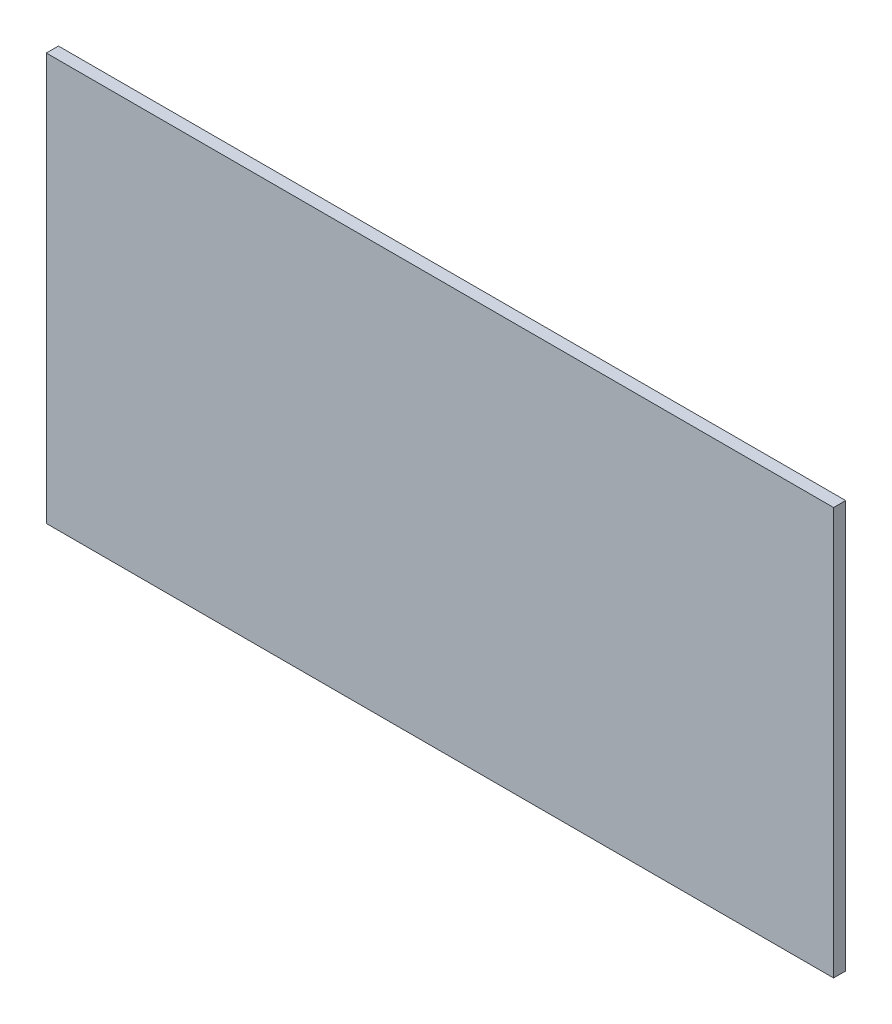
ISO-10303-21;
HEADER;
FILE_DESCRIPTION(('STEP AP214'),'2;1');
FILE_NAME('part.step','',(''),(''),'','','');
FILE_SCHEMA(('AUTOMOTIVE_DESIGN { 1 0 10303 214 1 1 1 1 }'));
ENDSEC;
DATA;
#1=APPLICATION_CONTEXT('core data for automotive mechanical design processes');
#2=APPLICATION_PROTOCOL_DEFINITION('international standard','automotive_design',2000,#1);
#3=PRODUCT_CONTEXT('',#1,'mechanical');
#4=PRODUCT('Part','Part','',(#3));
#5=PRODUCT_RELATED_PRODUCT_CATEGORY('part','',(#4));
#6=PRODUCT_DEFINITION_FORMATION('','',#4);
#7=PRODUCT_DEFINITION_CONTEXT('part definition',#1,'design');
#8=PRODUCT_DEFINITION('design','',#6,#7);
#9=PRODUCT_DEFINITION_SHAPE('','',#8);
#10=(LENGTH_UNIT() NAMED_UNIT(*) SI_UNIT(.MILLI.,.METRE.));
#11=(NAMED_UNIT(*) PLANE_ANGLE_UNIT() SI_UNIT($,.RADIAN.));
#12=(NAMED_UNIT(*) SI_UNIT($,.STERADIAN.) SOLID_ANGLE_UNIT());
#13=UNCERTAINTY_MEASURE_WITH_UNIT(LENGTH_MEASURE(1.E-05),#10,'distance_accuracy_value','');
#14=(GEOMETRIC_REPRESENTATION_CONTEXT(3) GLOBAL_UNCERTAINTY_ASSIGNED_CONTEXT((#13)) GLOBAL_UNIT_ASSIGNED_CONTEXT((#10,
#11,#12)) REPRESENTATION_CONTEXT('',''));
#15=CARTESIAN_POINT('',(0.,0.,0.));
#16=DIRECTION('',(0.,0.,1.));
#17=DIRECTION('',(1.,0.,0.));
#18=AXIS2_PLACEMENT_3D('',#15,#16,#17);
#19=CARTESIAN_POINT('',(65.,33.64,2.));
#20=DIRECTION('',(-1.,0.,0.));
#21=DIRECTION('',(0.,0.,1.));
#22=AXIS2_PLACEMENT_3D('',#19,#20,#21);
#23=PLANE('',#22);
#24=DIRECTION('',(0.,1.,0.));
#25=VECTOR('',#24,1.);
#26=CARTESIAN_POINT('',(65.,33.64,0.));
#27=LINE('',#26,#25);
#28=CARTESIAN_POINT('',(65.,-33.64,0.));
#29=VERTEX_POINT('',#28);
#30=CARTESIAN_POINT('',(65.,33.64,0.));
#31=VERTEX_POINT('',#30);
#32=EDGE_CURVE('E111',#29,#31,#27,.T.);
#33=ORIENTED_EDGE('',*,*,#32,.T.);
#34=DIRECTION('',(0.,0.,-1.));
#35=VECTOR('',#34,1.);
#36=CARTESIAN_POINT('',(65.,33.64,2.));
#37=LINE('',#36,#35);
#38=CARTESIAN_POINT('',(65.,33.64,2.));
#39=VERTEX_POINT('',#38);
#40=EDGE_CURVE('E11',#39,#31,#37,.T.);
#41=ORIENTED_EDGE('',*,*,#40,.F.);
#42=DIRECTION('',(0.,1.,0.));
#43=VECTOR('',#42,1.);
#44=CARTESIAN_POINT('',(65.,33.64,2.));
#45=LINE('',#44,#43);
#46=CARTESIAN_POINT('',(65.,-33.64,2.));
#47=VERTEX_POINT('',#46);
#48=EDGE_CURVE('E95',#47,#39,#45,.T.);
#49=ORIENTED_EDGE('',*,*,#48,.F.);
#50=DIRECTION('',(0.,0.,-1.));
#51=VECTOR('',#50,1.);
#52=CARTESIAN_POINT('',(65.,-33.64,2.));
#53=LINE('',#52,#51);
#54=EDGE_CURVE('E107',#47,#29,#53,.T.);
#55=ORIENTED_EDGE('',*,*,#54,.T.);
#56=EDGE_LOOP('',(#33,#41,#49,#55));
#57=FACE_BOUND('',#56,.T.);
#58=ADVANCED_FACE('F43',(#57),#23,.F.);
#59=CARTESIAN_POINT('',(-65.,33.64,2.));
#60=DIRECTION('',(0.,-1.,0.));
#61=DIRECTION('',(0.,0.,-1.));
#62=AXIS2_PLACEMENT_3D('',#59,#60,#61);
#63=PLANE('',#62);
#64=DIRECTION('',(-1.,0.,0.));
#65=VECTOR('',#64,1.);
#66=CARTESIAN_POINT('',(-65.,33.64,0.));
#67=LINE('',#66,#65);
#68=CARTESIAN_POINT('',(-65.,33.64,0.));
#69=VERTEX_POINT('',#68);
#70=EDGE_CURVE('E100',#31,#69,#67,.T.);
#71=ORIENTED_EDGE('',*,*,#70,.T.);
#72=DIRECTION('',(0.,0.,-1.));
#73=VECTOR('',#72,1.);
#74=CARTESIAN_POINT('',(-65.,33.64,2.));
#75=LINE('',#74,#73);
#76=CARTESIAN_POINT('',(-65.,33.64,2.));
#77=VERTEX_POINT('',#76);
#78=EDGE_CURVE('E52',#77,#69,#75,.T.);
#79=ORIENTED_EDGE('',*,*,#78,.F.);
#80=DIRECTION('',(-1.,0.,0.));
#81=VECTOR('',#80,1.);
#82=CARTESIAN_POINT('',(-65.,33.64,2.));
#83=LINE('',#82,#81);
#84=EDGE_CURVE('E90',#39,#77,#83,.T.);
#85=ORIENTED_EDGE('',*,*,#84,.F.);
#86=ORIENTED_EDGE('',*,*,#40,.T.);
#87=EDGE_LOOP('',(#71,#79,#85,#86));
#88=FACE_BOUND('',#87,.T.);
#89=ADVANCED_FACE('F99',(#88),#63,.F.);
#90=CARTESIAN_POINT('',(-65.,33.64,2.));
#91=DIRECTION('',(1.,0.,0.));
#92=DIRECTION('',(0.,0.,-1.));
#93=AXIS2_PLACEMENT_3D('',#90,#91,#92);
#94=PLANE('',#93);
#95=DIRECTION('',(0.,-1.,0.));
#96=VECTOR('',#95,1.);
#97=CARTESIAN_POINT('',(-65.,33.64,0.));
#98=LINE('',#97,#96);
#99=CARTESIAN_POINT('',(-65.,-33.64,0.));
#100=VERTEX_POINT('',#99);
#101=EDGE_CURVE('E77',#69,#100,#98,.T.);
#102=ORIENTED_EDGE('',*,*,#101,.T.);
#103=DIRECTION('',(0.,0.,-1.));
#104=VECTOR('',#103,1.);
#105=CARTESIAN_POINT('',(-65.,-33.64,2.));
#106=LINE('',#105,#104);
#107=CARTESIAN_POINT('',(-65.,-33.64,2.));
#108=VERTEX_POINT('',#107);
#109=EDGE_CURVE('E102',#108,#100,#106,.T.);
#110=ORIENTED_EDGE('',*,*,#109,.F.);
#111=DIRECTION('',(0.,-1.,0.));
#112=VECTOR('',#111,1.);
#113=CARTESIAN_POINT('',(-65.,33.64,2.));
#114=LINE('',#113,#112);
#115=EDGE_CURVE('E93',#77,#108,#114,.T.);
#116=ORIENTED_EDGE('',*,*,#115,.F.);
#117=ORIENTED_EDGE('',*,*,#78,.T.);
#118=EDGE_LOOP('',(#102,#110,#116,#117));
#119=FACE_BOUND('',#118,.T.);
#120=ADVANCED_FACE('F103',(#119),#94,.F.);
#121=CARTESIAN_POINT('',(-65.,-33.64,2.));
#122=DIRECTION('',(0.,1.,0.));
#123=DIRECTION('',(0.,0.,1.));
#124=AXIS2_PLACEMENT_3D('',#121,#122,#123);
#125=PLANE('',#124);
#126=DIRECTION('',(1.,0.,0.));
#127=VECTOR('',#126,1.);
#128=CARTESIAN_POINT('',(-65.,-33.64,0.));
#129=LINE('',#128,#127);
#130=EDGE_CURVE('E83',#100,#29,#129,.T.);
#131=ORIENTED_EDGE('',*,*,#130,.T.);
#132=ORIENTED_EDGE('',*,*,#54,.F.);
#133=DIRECTION('',(1.,0.,0.));
#134=VECTOR('',#133,1.);
#135=CARTESIAN_POINT('',(-65.,-33.64,2.));
#136=LINE('',#135,#134);
#137=EDGE_CURVE('E60',#108,#47,#136,.T.);
#138=ORIENTED_EDGE('',*,*,#137,.F.);
#139=ORIENTED_EDGE('',*,*,#109,.T.);
#140=EDGE_LOOP('',(#131,#132,#138,#139));
#141=FACE_BOUND('',#140,.T.);
#142=ADVANCED_FACE('F124',(#141),#125,.F.);
#143=CARTESIAN_POINT('',(0.,0.,2.));
#144=DIRECTION('',(0.,0.,1.));
#145=DIRECTION('',(1.,0.,0.));
#146=AXIS2_PLACEMENT_3D('',#143,#144,#145);
#147=PLANE('',#146);
#148=ORIENTED_EDGE('',*,*,#48,.T.);
#149=ORIENTED_EDGE('',*,*,#84,.T.);
#150=ORIENTED_EDGE('',*,*,#115,.T.);
#151=ORIENTED_EDGE('',*,*,#137,.T.);
#152=EDGE_LOOP('',(#148,#149,#150,#151));
#153=FACE_BOUND('',#152,.T.);
#154=ADVANCED_FACE('F91',(#153),#147,.T.);
#155=CARTESIAN_POINT('',(0.,0.,0.));
#156=DIRECTION('',(0.,0.,1.));
#157=DIRECTION('',(1.,0.,0.));
#158=AXIS2_PLACEMENT_3D('',#155,#156,#157);
#159=PLANE('',#158);
#160=ORIENTED_EDGE('',*,*,#32,.F.);
#161=ORIENTED_EDGE('',*,*,#130,.F.);
#162=ORIENTED_EDGE('',*,*,#101,.F.);
#163=ORIENTED_EDGE('',*,*,#70,.F.);
#164=EDGE_LOOP('',(#160,#161,#162,#163));
#165=FACE_BOUND('',#164,.T.);
#166=ADVANCED_FACE('F127',(#165),#159,.F.);
#167=CLOSED_SHELL('',(#58,#89,#120,#142,#154,#166));
#168=MANIFOLD_SOLID_BREP('B2',#167);
#169=ADVANCED_BREP_SHAPE_REPRESENTATION('',(#18,#168),#14);
#170=SHAPE_DEFINITION_REPRESENTATION(#9,#169);
ENDSEC;
END-ISO-10303-21;
